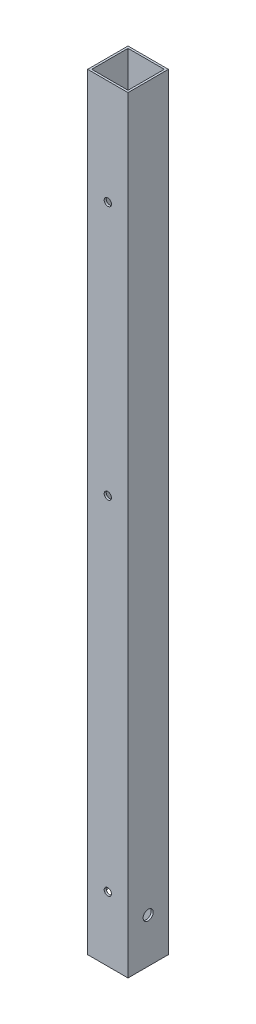
ISO-10303-21;
HEADER;
FILE_DESCRIPTION(('STEP AP214'),'2;1');
FILE_NAME('part.step','',(''),(''),'','','');
FILE_SCHEMA(('AUTOMOTIVE_DESIGN { 1 0 10303 214 1 1 1 1 }'));
ENDSEC;
DATA;
#1=APPLICATION_CONTEXT('core data for automotive mechanical design processes');
#2=APPLICATION_PROTOCOL_DEFINITION('international standard','automotive_design',2000,#1);
#3=PRODUCT_CONTEXT('',#1,'mechanical');
#4=PRODUCT('Part','Part','',(#3));
#5=PRODUCT_RELATED_PRODUCT_CATEGORY('part','',(#4));
#6=PRODUCT_DEFINITION_FORMATION('','',#4);
#7=PRODUCT_DEFINITION_CONTEXT('part definition',#1,'design');
#8=PRODUCT_DEFINITION('design','',#6,#7);
#9=PRODUCT_DEFINITION_SHAPE('','',#8);
#10=(LENGTH_UNIT() NAMED_UNIT(*) SI_UNIT(.MILLI.,.METRE.));
#11=(NAMED_UNIT(*) PLANE_ANGLE_UNIT() SI_UNIT($,.RADIAN.));
#12=(NAMED_UNIT(*) SI_UNIT($,.STERADIAN.) SOLID_ANGLE_UNIT());
#13=UNCERTAINTY_MEASURE_WITH_UNIT(LENGTH_MEASURE(1.E-05),#10,'distance_accuracy_value','');
#14=(GEOMETRIC_REPRESENTATION_CONTEXT(3) GLOBAL_UNCERTAINTY_ASSIGNED_CONTEXT((#13)) GLOBAL_UNIT_ASSIGNED_CONTEXT((#10,
#11,#12)) REPRESENTATION_CONTEXT('',''));
#15=CARTESIAN_POINT('',(0.,0.,0.));
#16=DIRECTION('',(0.,0.,1.));
#17=DIRECTION('',(1.,0.,0.));
#18=AXIS2_PLACEMENT_3D('',#15,#16,#17);
#19=CARTESIAN_POINT('',(0.,482.6,0.));
#20=DIRECTION('',(0.,-1.,0.));
#21=DIRECTION('',(0.,0.,-1.));
#22=AXIS2_PLACEMENT_3D('',#19,#20,#21);
#23=PLANE('',#22);
#24=DIRECTION('',(1.,0.,0.));
#25=VECTOR('',#24,1.);
#26=CARTESIAN_POINT('',(25.4,482.6,0.));
#27=LINE('',#26,#25);
#28=CARTESIAN_POINT('',(0.,482.6,0.));
#29=VERTEX_POINT('',#28);
#30=CARTESIAN_POINT('',(25.4,482.6,0.));
#31=VERTEX_POINT('',#30);
#32=EDGE_CURVE('E141',#29,#31,#27,.T.);
#33=ORIENTED_EDGE('',*,*,#32,.T.);
#34=DIRECTION('',(0.,0.,-1.));
#35=VECTOR('',#34,1.);
#36=CARTESIAN_POINT('',(25.4,482.6,-25.4));
#37=LINE('',#36,#35);
#38=CARTESIAN_POINT('',(25.4,482.6,-25.4));
#39=VERTEX_POINT('',#38);
#40=EDGE_CURVE('E144',#31,#39,#37,.T.);
#41=ORIENTED_EDGE('',*,*,#40,.T.);
#42=DIRECTION('',(-1.,0.,0.));
#43=VECTOR('',#42,1.);
#44=CARTESIAN_POINT('',(0.,482.6,-25.4));
#45=LINE('',#44,#43);
#46=CARTESIAN_POINT('',(0.,482.6,-25.4));
#47=VERTEX_POINT('',#46);
#48=EDGE_CURVE('E147',#39,#47,#45,.T.);
#49=ORIENTED_EDGE('',*,*,#48,.T.);
#50=DIRECTION('',(0.,0.,1.));
#51=VECTOR('',#50,1.);
#52=CARTESIAN_POINT('',(0.,482.6,0.));
#53=LINE('',#52,#51);
#54=EDGE_CURVE('E149',#47,#29,#53,.T.);
#55=ORIENTED_EDGE('',*,*,#54,.T.);
#56=EDGE_LOOP('',(#33,#41,#49,#55));
#57=FACE_BOUND('',#56,.T.);
#58=DIRECTION('',(1.,0.,0.));
#59=VECTOR('',#58,1.);
#60=CARTESIAN_POINT('',(1.27,482.6,-1.27));
#61=LINE('',#60,#59);
#62=CARTESIAN_POINT('',(1.27,482.6,-1.27));
#63=VERTEX_POINT('',#62);
#64=CARTESIAN_POINT('',(24.13,482.6,-1.27));
#65=VERTEX_POINT('',#64);
#66=EDGE_CURVE('E106',#63,#65,#61,.T.);
#67=ORIENTED_EDGE('',*,*,#66,.F.);
#68=DIRECTION('',(0.,0.,1.));
#69=VECTOR('',#68,1.);
#70=CARTESIAN_POINT('',(1.27,482.6,-12.3614591557052));
#71=LINE('',#70,#69);
#72=CARTESIAN_POINT('',(1.27,482.6,-24.13));
#73=VERTEX_POINT('',#72);
#74=EDGE_CURVE('E101',#73,#63,#71,.T.);
#75=ORIENTED_EDGE('',*,*,#74,.F.);
#76=DIRECTION('',(-1.,0.,0.));
#77=VECTOR('',#76,1.);
#78=CARTESIAN_POINT('',(12.7,482.6,-24.13));
#79=LINE('',#78,#77);
#80=CARTESIAN_POINT('',(24.13,482.6,-24.13));
#81=VERTEX_POINT('',#80);
#82=EDGE_CURVE('E122',#81,#73,#79,.T.);
#83=ORIENTED_EDGE('',*,*,#82,.F.);
#84=DIRECTION('',(0.,0.,-1.));
#85=VECTOR('',#84,1.);
#86=CARTESIAN_POINT('',(24.13,482.6,-1.27));
#87=LINE('',#86,#85);
#88=EDGE_CURVE('E120',#65,#81,#87,.T.);
#89=ORIENTED_EDGE('',*,*,#88,.F.);
#90=EDGE_LOOP('',(#67,#75,#83,#89));
#91=FACE_BOUND('',#90,.T.);
#92=ADVANCED_FACE('F37',(#57,#91),#23,.F.);
#93=CARTESIAN_POINT('',(0.,0.,0.));
#94=DIRECTION('',(0.,-1.,0.));
#95=DIRECTION('',(0.,0.,-1.));
#96=AXIS2_PLACEMENT_3D('',#93,#94,#95);
#97=PLANE('',#96);
#98=DIRECTION('',(1.,0.,0.));
#99=VECTOR('',#98,1.);
#100=CARTESIAN_POINT('',(25.4,0.,0.));
#101=LINE('',#100,#99);
#102=CARTESIAN_POINT('',(0.,0.,0.));
#103=VERTEX_POINT('',#102);
#104=CARTESIAN_POINT('',(25.4,0.,0.));
#105=VERTEX_POINT('',#104);
#106=EDGE_CURVE('E116',#103,#105,#101,.T.);
#107=ORIENTED_EDGE('',*,*,#106,.F.);
#108=DIRECTION('',(0.,0.,1.));
#109=VECTOR('',#108,1.);
#110=CARTESIAN_POINT('',(0.,0.,0.));
#111=LINE('',#110,#109);
#112=CARTESIAN_POINT('',(0.,0.,-25.4));
#113=VERTEX_POINT('',#112);
#114=EDGE_CURVE('E145',#113,#103,#111,.T.);
#115=ORIENTED_EDGE('',*,*,#114,.F.);
#116=DIRECTION('',(-1.,0.,0.));
#117=VECTOR('',#116,1.);
#118=CARTESIAN_POINT('',(0.,0.,-25.4));
#119=LINE('',#118,#117);
#120=CARTESIAN_POINT('',(25.4,0.,-25.4));
#121=VERTEX_POINT('',#120);
#122=EDGE_CURVE('E156',#121,#113,#119,.T.);
#123=ORIENTED_EDGE('',*,*,#122,.F.);
#124=DIRECTION('',(0.,0.,-1.));
#125=VECTOR('',#124,1.);
#126=CARTESIAN_POINT('',(25.4,0.,-25.4));
#127=LINE('',#126,#125);
#128=EDGE_CURVE('E154',#105,#121,#127,.T.);
#129=ORIENTED_EDGE('',*,*,#128,.F.);
#130=EDGE_LOOP('',(#107,#115,#123,#129));
#131=FACE_BOUND('',#130,.T.);
#132=DIRECTION('',(0.,0.,1.));
#133=VECTOR('',#132,1.);
#134=CARTESIAN_POINT('',(1.27,0.,-12.3614591557052));
#135=LINE('',#134,#133);
#136=CARTESIAN_POINT('',(1.27,0.,-24.13));
#137=VERTEX_POINT('',#136);
#138=CARTESIAN_POINT('',(1.27,0.,-1.27));
#139=VERTEX_POINT('',#138);
#140=EDGE_CURVE('E107',#137,#139,#135,.T.);
#141=ORIENTED_EDGE('',*,*,#140,.T.);
#142=DIRECTION('',(1.,0.,0.));
#143=VECTOR('',#142,1.);
#144=CARTESIAN_POINT('',(24.13,0.,-1.27));
#145=LINE('',#144,#143);
#146=CARTESIAN_POINT('',(24.13,0.,-1.27));
#147=VERTEX_POINT('',#146);
#148=EDGE_CURVE('E114',#139,#147,#145,.T.);
#149=ORIENTED_EDGE('',*,*,#148,.T.);
#150=DIRECTION('',(0.,0.,-1.));
#151=VECTOR('',#150,1.);
#152=CARTESIAN_POINT('',(24.13,0.,-24.13));
#153=LINE('',#152,#151);
#154=CARTESIAN_POINT('',(24.13,0.,-24.13));
#155=VERTEX_POINT('',#154);
#156=EDGE_CURVE('E128',#147,#155,#153,.T.);
#157=ORIENTED_EDGE('',*,*,#156,.T.);
#158=DIRECTION('',(-1.,0.,0.));
#159=VECTOR('',#158,1.);
#160=CARTESIAN_POINT('',(1.27,0.,-24.13));
#161=LINE('',#160,#159);
#162=EDGE_CURVE('E132',#155,#137,#161,.T.);
#163=ORIENTED_EDGE('',*,*,#162,.T.);
#164=EDGE_LOOP('',(#141,#149,#157,#163));
#165=FACE_BOUND('',#164,.T.);
#166=ADVANCED_FACE('F229',(#131,#165),#97,.T.);
#167=CARTESIAN_POINT('',(25.4,482.6,0.));
#168=DIRECTION('',(0.,0.,-1.));
#169=DIRECTION('',(-1.,0.,0.));
#170=AXIS2_PLACEMENT_3D('',#167,#168,#169);
#171=PLANE('',#170);
#172=CARTESIAN_POINT('',(12.7,256.54,0.));
#173=DIRECTION('',(0.,0.,-1.));
#174=DIRECTION('',(-1.,0.,0.));
#175=AXIS2_PLACEMENT_3D('',#172,#173,#174);
#176=CIRCLE('',#175,2.28600000000001);
#177=CARTESIAN_POINT('',(10.414,256.54,0.));
#178=VERTEX_POINT('',#177);
#179=EDGE_CURVE('E177',#178,#178,#176,.T.);
#180=ORIENTED_EDGE('',*,*,#179,.T.);
#181=EDGE_LOOP('',(#180));
#182=FACE_BOUND('',#181,.T.);
#183=CARTESIAN_POINT('',(12.7,40.64,0.));
#184=DIRECTION('',(0.,0.,-1.));
#185=DIRECTION('',(-1.,0.,0.));
#186=AXIS2_PLACEMENT_3D('',#183,#184,#185);
#187=CIRCLE('',#186,2.286);
#188=CARTESIAN_POINT('',(10.414,40.64,0.));
#189=VERTEX_POINT('',#188);
#190=EDGE_CURVE('E173',#189,#189,#187,.T.);
#191=ORIENTED_EDGE('',*,*,#190,.T.);
#192=EDGE_LOOP('',(#191));
#193=FACE_BOUND('',#192,.T.);
#194=CARTESIAN_POINT('',(12.7,416.56,0.));
#195=DIRECTION('',(0.,0.,-1.));
#196=DIRECTION('',(-1.,0.,0.));
#197=AXIS2_PLACEMENT_3D('',#194,#195,#196);
#198=CIRCLE('',#197,2.28600000000001);
#199=CARTESIAN_POINT('',(10.414,416.56,0.));
#200=VERTEX_POINT('',#199);
#201=EDGE_CURVE('E169',#200,#200,#198,.T.);
#202=ORIENTED_EDGE('',*,*,#201,.T.);
#203=EDGE_LOOP('',(#202));
#204=FACE_BOUND('',#203,.T.);
#205=ORIENTED_EDGE('',*,*,#106,.T.);
#206=DIRECTION('',(0.,-1.,0.));
#207=VECTOR('',#206,1.);
#208=CARTESIAN_POINT('',(25.4,482.6,0.));
#209=LINE('',#208,#207);
#210=EDGE_CURVE('E11',#31,#105,#209,.T.);
#211=ORIENTED_EDGE('',*,*,#210,.F.);
#212=ORIENTED_EDGE('',*,*,#32,.F.);
#213=DIRECTION('',(0.,-1.,0.));
#214=VECTOR('',#213,1.);
#215=CARTESIAN_POINT('',(0.,482.6,0.));
#216=LINE('',#215,#214);
#217=EDGE_CURVE('E151',#29,#103,#216,.T.);
#218=ORIENTED_EDGE('',*,*,#217,.T.);
#219=EDGE_LOOP('',(#205,#211,#212,#218));
#220=FACE_BOUND('',#219,.T.);
#221=ADVANCED_FACE('F39',(#182,#193,#204,#220),#171,.F.);
#222=CARTESIAN_POINT('',(25.4,482.6,-25.4));
#223=DIRECTION('',(-1.,0.,0.));
#224=DIRECTION('',(0.,0.,1.));
#225=AXIS2_PLACEMENT_3D('',#222,#223,#224);
#226=PLANE('',#225);
#227=CARTESIAN_POINT('',(25.4,27.94,-12.7));
#228=DIRECTION('',(-1.,0.,0.));
#229=DIRECTION('',(0.,0.,1.));
#230=AXIS2_PLACEMENT_3D('',#227,#228,#229);
#231=CIRCLE('',#230,3.175);
#232=CARTESIAN_POINT('',(25.4,27.94,-9.525));
#233=VERTEX_POINT('',#232);
#234=EDGE_CURVE('E248',#233,#233,#231,.T.);
#235=ORIENTED_EDGE('',*,*,#234,.T.);
#236=EDGE_LOOP('',(#235));
#237=FACE_BOUND('',#236,.T.);
#238=ORIENTED_EDGE('',*,*,#128,.T.);
#239=DIRECTION('',(0.,-1.,0.));
#240=VECTOR('',#239,1.);
#241=CARTESIAN_POINT('',(25.4,482.6,-25.4));
#242=LINE('',#241,#240);
#243=EDGE_CURVE('E46',#39,#121,#242,.T.);
#244=ORIENTED_EDGE('',*,*,#243,.F.);
#245=ORIENTED_EDGE('',*,*,#40,.F.);
#246=ORIENTED_EDGE('',*,*,#210,.T.);
#247=EDGE_LOOP('',(#238,#244,#245,#246));
#248=FACE_BOUND('',#247,.T.);
#249=ADVANCED_FACE('F238',(#237,#248),#226,.F.);
#250=CARTESIAN_POINT('',(0.,482.6,-25.4));
#251=DIRECTION('',(0.,0.,1.));
#252=DIRECTION('',(1.,0.,0.));
#253=AXIS2_PLACEMENT_3D('',#250,#251,#252);
#254=PLANE('',#253);
#255=CARTESIAN_POINT('',(12.7,256.54,-25.4));
#256=DIRECTION('',(0.,0.,-1.));
#257=DIRECTION('',(-1.,0.,0.));
#258=AXIS2_PLACEMENT_3D('',#255,#256,#257);
#259=CIRCLE('',#258,2.28600000000001);
#260=CARTESIAN_POINT('',(10.414,256.54,-25.4));
#261=VERTEX_POINT('',#260);
#262=EDGE_CURVE('E184',#261,#261,#259,.T.);
#263=ORIENTED_EDGE('',*,*,#262,.F.);
#264=EDGE_LOOP('',(#263));
#265=FACE_BOUND('',#264,.T.);
#266=CARTESIAN_POINT('',(12.7,40.64,-25.4));
#267=DIRECTION('',(0.,0.,-1.));
#268=DIRECTION('',(-1.,0.,0.));
#269=AXIS2_PLACEMENT_3D('',#266,#267,#268);
#270=CIRCLE('',#269,2.286);
#271=CARTESIAN_POINT('',(10.414,40.64,-25.4));
#272=VERTEX_POINT('',#271);
#273=EDGE_CURVE('E181',#272,#272,#270,.T.);
#274=ORIENTED_EDGE('',*,*,#273,.F.);
#275=EDGE_LOOP('',(#274));
#276=FACE_BOUND('',#275,.T.);
#277=CARTESIAN_POINT('',(12.7,416.56,-25.4));
#278=DIRECTION('',(0.,0.,-1.));
#279=DIRECTION('',(-1.,0.,0.));
#280=AXIS2_PLACEMENT_3D('',#277,#278,#279);
#281=CIRCLE('',#280,2.28600000000001);
#282=CARTESIAN_POINT('',(10.414,416.56,-25.4));
#283=VERTEX_POINT('',#282);
#284=EDGE_CURVE('E200',#283,#283,#281,.T.);
#285=ORIENTED_EDGE('',*,*,#284,.F.);
#286=EDGE_LOOP('',(#285));
#287=FACE_BOUND('',#286,.T.);
#288=ORIENTED_EDGE('',*,*,#122,.T.);
#289=DIRECTION('',(0.,-1.,0.));
#290=VECTOR('',#289,1.);
#291=CARTESIAN_POINT('',(0.,482.6,-25.4));
#292=LINE('',#291,#290);
#293=EDGE_CURVE('E161',#47,#113,#292,.T.);
#294=ORIENTED_EDGE('',*,*,#293,.F.);
#295=ORIENTED_EDGE('',*,*,#48,.F.);
#296=ORIENTED_EDGE('',*,*,#243,.T.);
#297=EDGE_LOOP('',(#288,#294,#295,#296));
#298=FACE_BOUND('',#297,.T.);
#299=ADVANCED_FACE('F222',(#265,#276,#287,#298),#254,.F.);
#300=CARTESIAN_POINT('',(0.,482.6,0.));
#301=DIRECTION('',(1.,0.,0.));
#302=DIRECTION('',(0.,0.,-1.));
#303=AXIS2_PLACEMENT_3D('',#300,#301,#302);
#304=PLANE('',#303);
#305=CARTESIAN_POINT('',(0.,27.94,-12.7));
#306=DIRECTION('',(-1.,0.,0.));
#307=DIRECTION('',(0.,0.,1.));
#308=AXIS2_PLACEMENT_3D('',#305,#306,#307);
#309=CIRCLE('',#308,3.175);
#310=CARTESIAN_POINT('',(0.,27.94,-9.525));
#311=VERTEX_POINT('',#310);
#312=EDGE_CURVE('E304',#311,#311,#309,.T.);
#313=ORIENTED_EDGE('',*,*,#312,.F.);
#314=EDGE_LOOP('',(#313));
#315=FACE_BOUND('',#314,.T.);
#316=ORIENTED_EDGE('',*,*,#114,.T.);
#317=ORIENTED_EDGE('',*,*,#217,.F.);
#318=ORIENTED_EDGE('',*,*,#54,.F.);
#319=ORIENTED_EDGE('',*,*,#293,.T.);
#320=EDGE_LOOP('',(#316,#317,#318,#319));
#321=FACE_BOUND('',#320,.T.);
#322=ADVANCED_FACE('F212',(#315,#321),#304,.F.);
#323=CARTESIAN_POINT('',(24.13,482.6,-1.27));
#324=DIRECTION('',(0.,0.,-1.));
#325=DIRECTION('',(-1.,0.,0.));
#326=AXIS2_PLACEMENT_3D('',#323,#324,#325);
#327=PLANE('',#326);
#328=CARTESIAN_POINT('',(12.7,256.54,-1.27));
#329=DIRECTION('',(0.,0.,-1.));
#330=DIRECTION('',(-1.,0.,0.));
#331=AXIS2_PLACEMENT_3D('',#328,#329,#330);
#332=CIRCLE('',#331,2.28600000000001);
#333=CARTESIAN_POINT('',(10.414,256.54,-1.27));
#334=VERTEX_POINT('',#333);
#335=EDGE_CURVE('E176',#334,#334,#332,.T.);
#336=ORIENTED_EDGE('',*,*,#335,.F.);
#337=EDGE_LOOP('',(#336));
#338=FACE_BOUND('',#337,.T.);
#339=CARTESIAN_POINT('',(12.7,40.64,-1.27));
#340=DIRECTION('',(0.,0.,-1.));
#341=DIRECTION('',(-1.,0.,0.));
#342=AXIS2_PLACEMENT_3D('',#339,#340,#341);
#343=CIRCLE('',#342,2.286);
#344=CARTESIAN_POINT('',(10.414,40.64,-1.27));
#345=VERTEX_POINT('',#344);
#346=EDGE_CURVE('E172',#345,#345,#343,.T.);
#347=ORIENTED_EDGE('',*,*,#346,.F.);
#348=EDGE_LOOP('',(#347));
#349=FACE_BOUND('',#348,.T.);
#350=CARTESIAN_POINT('',(12.7,416.56,-1.27));
#351=DIRECTION('',(0.,0.,-1.));
#352=DIRECTION('',(-1.,0.,0.));
#353=AXIS2_PLACEMENT_3D('',#350,#351,#352);
#354=CIRCLE('',#353,2.28600000000001);
#355=CARTESIAN_POINT('',(10.414,416.56,-1.27));
#356=VERTEX_POINT('',#355);
#357=EDGE_CURVE('E129',#356,#356,#354,.T.);
#358=ORIENTED_EDGE('',*,*,#357,.F.);
#359=EDGE_LOOP('',(#358));
#360=FACE_BOUND('',#359,.T.);
#361=ORIENTED_EDGE('',*,*,#148,.F.);
#362=DIRECTION('',(0.,-1.,0.));
#363=VECTOR('',#362,1.);
#364=CARTESIAN_POINT('',(1.27,482.6,-1.27));
#365=LINE('',#364,#363);
#366=EDGE_CURVE('E59',#63,#139,#365,.T.);
#367=ORIENTED_EDGE('',*,*,#366,.F.);
#368=ORIENTED_EDGE('',*,*,#66,.T.);
#369=DIRECTION('',(0.,-1.,0.));
#370=VECTOR('',#369,1.);
#371=CARTESIAN_POINT('',(24.13,482.6,-1.27));
#372=LINE('',#371,#370);
#373=EDGE_CURVE('E117',#65,#147,#372,.T.);
#374=ORIENTED_EDGE('',*,*,#373,.T.);
#375=EDGE_LOOP('',(#361,#367,#368,#374));
#376=FACE_BOUND('',#375,.T.);
#377=ADVANCED_FACE('F110',(#338,#349,#360,#376),#327,.T.);
#378=CARTESIAN_POINT('',(24.13,482.6,-24.13));
#379=DIRECTION('',(-1.,0.,0.));
#380=DIRECTION('',(0.,0.,1.));
#381=AXIS2_PLACEMENT_3D('',#378,#379,#380);
#382=PLANE('',#381);
#383=CARTESIAN_POINT('',(24.13,27.94,-12.7));
#384=DIRECTION('',(-1.,0.,0.));
#385=DIRECTION('',(0.,0.,1.));
#386=AXIS2_PLACEMENT_3D('',#383,#384,#385);
#387=CIRCLE('',#386,3.175);
#388=CARTESIAN_POINT('',(24.13,27.94,-9.525));
#389=VERTEX_POINT('',#388);
#390=EDGE_CURVE('E189',#389,#389,#387,.T.);
#391=ORIENTED_EDGE('',*,*,#390,.F.);
#392=EDGE_LOOP('',(#391));
#393=FACE_BOUND('',#392,.T.);
#394=ORIENTED_EDGE('',*,*,#156,.F.);
#395=ORIENTED_EDGE('',*,*,#373,.F.);
#396=ORIENTED_EDGE('',*,*,#88,.T.);
#397=DIRECTION('',(0.,-1.,0.));
#398=VECTOR('',#397,1.);
#399=CARTESIAN_POINT('',(24.13,482.6,-24.13));
#400=LINE('',#399,#398);
#401=EDGE_CURVE('E137',#81,#155,#400,.T.);
#402=ORIENTED_EDGE('',*,*,#401,.T.);
#403=EDGE_LOOP('',(#394,#395,#396,#402));
#404=FACE_BOUND('',#403,.T.);
#405=ADVANCED_FACE('F211',(#393,#404),#382,.T.);
#406=CARTESIAN_POINT('',(1.27,482.6,-24.13));
#407=DIRECTION('',(0.,0.,1.));
#408=DIRECTION('',(1.,0.,0.));
#409=AXIS2_PLACEMENT_3D('',#406,#407,#408);
#410=PLANE('',#409);
#411=CARTESIAN_POINT('',(12.7,256.54,-24.13));
#412=DIRECTION('',(0.,0.,1.));
#413=DIRECTION('',(1.,0.,0.));
#414=AXIS2_PLACEMENT_3D('',#411,#412,#413);
#415=CIRCLE('',#414,2.28600000000001);
#416=CARTESIAN_POINT('',(14.986,256.54,-24.13));
#417=VERTEX_POINT('',#416);
#418=EDGE_CURVE('E174',#417,#417,#415,.T.);
#419=ORIENTED_EDGE('',*,*,#418,.F.);
#420=EDGE_LOOP('',(#419));
#421=FACE_BOUND('',#420,.T.);
#422=CARTESIAN_POINT('',(12.7,40.64,-24.13));
#423=DIRECTION('',(0.,0.,1.));
#424=DIRECTION('',(1.,0.,0.));
#425=AXIS2_PLACEMENT_3D('',#422,#423,#424);
#426=CIRCLE('',#425,2.286);
#427=CARTESIAN_POINT('',(14.986,40.64,-24.13));
#428=VERTEX_POINT('',#427);
#429=EDGE_CURVE('E170',#428,#428,#426,.T.);
#430=ORIENTED_EDGE('',*,*,#429,.F.);
#431=EDGE_LOOP('',(#430));
#432=FACE_BOUND('',#431,.T.);
#433=CARTESIAN_POINT('',(12.7,416.56,-24.13));
#434=DIRECTION('',(0.,0.,1.));
#435=DIRECTION('',(1.,0.,0.));
#436=AXIS2_PLACEMENT_3D('',#433,#434,#435);
#437=CIRCLE('',#436,2.28600000000001);
#438=CARTESIAN_POINT('',(14.986,416.56,-24.13));
#439=VERTEX_POINT('',#438);
#440=EDGE_CURVE('E166',#439,#439,#437,.T.);
#441=ORIENTED_EDGE('',*,*,#440,.F.);
#442=EDGE_LOOP('',(#441));
#443=FACE_BOUND('',#442,.T.);
#444=ORIENTED_EDGE('',*,*,#162,.F.);
#445=ORIENTED_EDGE('',*,*,#401,.F.);
#446=ORIENTED_EDGE('',*,*,#82,.T.);
#447=DIRECTION('',(0.,-1.,0.));
#448=VECTOR('',#447,1.);
#449=CARTESIAN_POINT('',(1.27,482.6,-24.13));
#450=LINE('',#449,#448);
#451=EDGE_CURVE('E54',#73,#137,#450,.T.);
#452=ORIENTED_EDGE('',*,*,#451,.T.);
#453=EDGE_LOOP('',(#444,#445,#446,#452));
#454=FACE_BOUND('',#453,.T.);
#455=ADVANCED_FACE('F219',(#421,#432,#443,#454),#410,.T.);
#456=CARTESIAN_POINT('',(1.27,482.6,-12.3614591557052));
#457=DIRECTION('',(1.,0.,0.));
#458=DIRECTION('',(0.,0.,-1.));
#459=AXIS2_PLACEMENT_3D('',#456,#457,#458);
#460=PLANE('',#459);
#461=CARTESIAN_POINT('',(1.27,27.94,-12.7));
#462=DIRECTION('',(1.,0.,0.));
#463=DIRECTION('',(0.,0.,-1.));
#464=AXIS2_PLACEMENT_3D('',#461,#462,#463);
#465=CIRCLE('',#464,3.175);
#466=CARTESIAN_POINT('',(1.27,27.94,-15.875));
#467=VERTEX_POINT('',#466);
#468=EDGE_CURVE('E41',#467,#467,#465,.T.);
#469=ORIENTED_EDGE('',*,*,#468,.F.);
#470=EDGE_LOOP('',(#469));
#471=FACE_BOUND('',#470,.T.);
#472=ORIENTED_EDGE('',*,*,#140,.F.);
#473=ORIENTED_EDGE('',*,*,#451,.F.);
#474=ORIENTED_EDGE('',*,*,#74,.T.);
#475=ORIENTED_EDGE('',*,*,#366,.T.);
#476=EDGE_LOOP('',(#472,#473,#474,#475));
#477=FACE_BOUND('',#476,.T.);
#478=ADVANCED_FACE('F102',(#471,#477),#460,.T.);
#479=CARTESIAN_POINT('',(12.7,416.56,0.));
#480=DIRECTION('',(0.,0.,-1.));
#481=DIRECTION('',(-1.,0.,0.));
#482=AXIS2_PLACEMENT_3D('',#479,#480,#481);
#483=CYLINDRICAL_SURFACE('',#482,2.28600000000001);
#484=ORIENTED_EDGE('',*,*,#440,.T.);
#485=EDGE_LOOP('',(#484));
#486=FACE_BOUND('',#485,.T.);
#487=ORIENTED_EDGE('',*,*,#284,.T.);
#488=EDGE_LOOP('',(#487));
#489=FACE_BOUND('',#488,.T.);
#490=ADVANCED_FACE('F272',(#486,#489),#483,.F.);
#491=ORIENTED_EDGE('',*,*,#357,.T.);
#492=EDGE_LOOP('',(#491));
#493=FACE_BOUND('',#492,.T.);
#494=ORIENTED_EDGE('',*,*,#201,.F.);
#495=EDGE_LOOP('',(#494));
#496=FACE_BOUND('',#495,.T.);
#497=ADVANCED_FACE('F207',(#493,#496),#483,.F.);
#498=CARTESIAN_POINT('',(12.7,40.64,0.));
#499=DIRECTION('',(0.,0.,-1.));
#500=DIRECTION('',(-1.,0.,0.));
#501=AXIS2_PLACEMENT_3D('',#498,#499,#500);
#502=CYLINDRICAL_SURFACE('',#501,2.286);
#503=ORIENTED_EDGE('',*,*,#429,.T.);
#504=EDGE_LOOP('',(#503));
#505=FACE_BOUND('',#504,.T.);
#506=ORIENTED_EDGE('',*,*,#273,.T.);
#507=EDGE_LOOP('',(#506));
#508=FACE_BOUND('',#507,.T.);
#509=ADVANCED_FACE('F280',(#505,#508),#502,.F.);
#510=ORIENTED_EDGE('',*,*,#346,.T.);
#511=EDGE_LOOP('',(#510));
#512=FACE_BOUND('',#511,.T.);
#513=ORIENTED_EDGE('',*,*,#190,.F.);
#514=EDGE_LOOP('',(#513));
#515=FACE_BOUND('',#514,.T.);
#516=ADVANCED_FACE('F283',(#512,#515),#502,.F.);
#517=CARTESIAN_POINT('',(12.7,256.54,0.));
#518=DIRECTION('',(0.,0.,-1.));
#519=DIRECTION('',(-1.,0.,0.));
#520=AXIS2_PLACEMENT_3D('',#517,#518,#519);
#521=CYLINDRICAL_SURFACE('',#520,2.28600000000001);
#522=ORIENTED_EDGE('',*,*,#418,.T.);
#523=EDGE_LOOP('',(#522));
#524=FACE_BOUND('',#523,.T.);
#525=ORIENTED_EDGE('',*,*,#262,.T.);
#526=EDGE_LOOP('',(#525));
#527=FACE_BOUND('',#526,.T.);
#528=ADVANCED_FACE('F285',(#524,#527),#521,.F.);
#529=ORIENTED_EDGE('',*,*,#335,.T.);
#530=EDGE_LOOP('',(#529));
#531=FACE_BOUND('',#530,.T.);
#532=ORIENTED_EDGE('',*,*,#179,.F.);
#533=EDGE_LOOP('',(#532));
#534=FACE_BOUND('',#533,.T.);
#535=ADVANCED_FACE('F288',(#531,#534),#521,.F.);
#536=CARTESIAN_POINT('',(25.4,27.94,-12.7));
#537=DIRECTION('',(-1.,0.,0.));
#538=DIRECTION('',(0.,0.,1.));
#539=AXIS2_PLACEMENT_3D('',#536,#537,#538);
#540=CYLINDRICAL_SURFACE('',#539,3.175);
#541=ORIENTED_EDGE('',*,*,#468,.T.);
#542=EDGE_LOOP('',(#541));
#543=FACE_BOUND('',#542,.T.);
#544=ORIENTED_EDGE('',*,*,#312,.T.);
#545=EDGE_LOOP('',(#544));
#546=FACE_BOUND('',#545,.T.);
#547=ADVANCED_FACE('F289',(#543,#546),#540,.F.);
#548=ORIENTED_EDGE('',*,*,#390,.T.);
#549=EDGE_LOOP('',(#548));
#550=FACE_BOUND('',#549,.T.);
#551=ORIENTED_EDGE('',*,*,#234,.F.);
#552=EDGE_LOOP('',(#551));
#553=FACE_BOUND('',#552,.T.);
#554=ADVANCED_FACE('F291',(#550,#553),#540,.F.);
#555=CLOSED_SHELL('',(#92,#166,#221,#249,#299,#322,#377,#405,#455,#478,#490,#497,#509,#516,#528,
#535,#547,#554));
#556=MANIFOLD_SOLID_BREP('B2',#555);
#557=ADVANCED_BREP_SHAPE_REPRESENTATION('',(#18,#556),#14);
#558=SHAPE_DEFINITION_REPRESENTATION(#9,#557);
ENDSEC;
END-ISO-10303-21;
